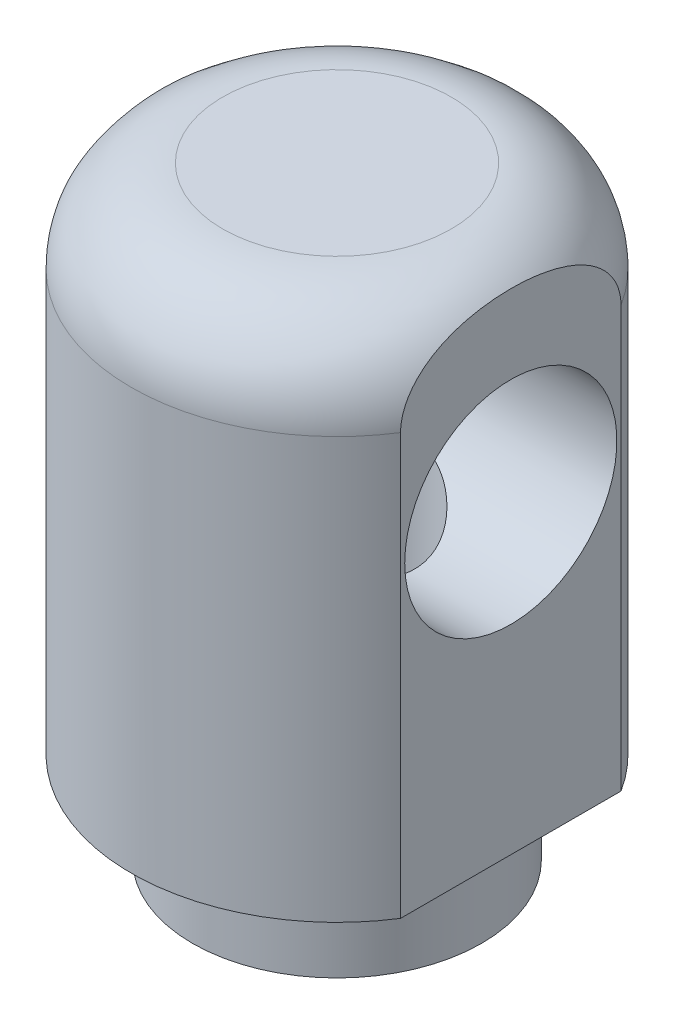
ISO-10303-21;
HEADER;
FILE_DESCRIPTION(('STEP AP214'),'2;1');
FILE_NAME('part.step','',(''),(''),'','','');
FILE_SCHEMA(('AUTOMOTIVE_DESIGN { 1 0 10303 214 1 1 1 1 }'));
ENDSEC;
DATA;
#1=APPLICATION_CONTEXT('core data for automotive mechanical design processes');
#2=APPLICATION_PROTOCOL_DEFINITION('international standard','automotive_design',2000,#1);
#3=PRODUCT_CONTEXT('',#1,'mechanical');
#4=PRODUCT('Part','Part','',(#3));
#5=PRODUCT_RELATED_PRODUCT_CATEGORY('part','',(#4));
#6=PRODUCT_DEFINITION_FORMATION('','',#4);
#7=PRODUCT_DEFINITION_CONTEXT('part definition',#1,'design');
#8=PRODUCT_DEFINITION('design','',#6,#7);
#9=PRODUCT_DEFINITION_SHAPE('','',#8);
#10=(LENGTH_UNIT() NAMED_UNIT(*) SI_UNIT(.MILLI.,.METRE.));
#11=(NAMED_UNIT(*) PLANE_ANGLE_UNIT() SI_UNIT($,.RADIAN.));
#12=(NAMED_UNIT(*) SI_UNIT($,.STERADIAN.) SOLID_ANGLE_UNIT());
#13=UNCERTAINTY_MEASURE_WITH_UNIT(LENGTH_MEASURE(1.E-05),#10,'distance_accuracy_value','');
#14=(GEOMETRIC_REPRESENTATION_CONTEXT(3) GLOBAL_UNCERTAINTY_ASSIGNED_CONTEXT((#13)) GLOBAL_UNIT_ASSIGNED_CONTEXT((#10,
#11,#12)) REPRESENTATION_CONTEXT('',''));
#15=CARTESIAN_POINT('',(0.,0.,0.));
#16=DIRECTION('',(0.,0.,1.));
#17=DIRECTION('',(1.,0.,0.));
#18=AXIS2_PLACEMENT_3D('',#15,#16,#17);
#19=CARTESIAN_POINT('',(0.,33.,0.));
#20=DIRECTION('',(0.,-1.,0.));
#21=DIRECTION('',(0.,0.,-1.));
#22=AXIS2_PLACEMENT_3D('',#19,#20,#21);
#23=CYLINDRICAL_SURFACE('',#22,11.25);
#24=CARTESIAN_POINT('',(0.,5.,0.));
#25=DIRECTION('',(0.,-1.,0.));
#26=DIRECTION('',(0.,0.,-1.));
#27=AXIS2_PLACEMENT_3D('',#24,#25,#26);
#28=CIRCLE('',#27,11.25);
#29=CARTESIAN_POINT('',(-9.5,5.,-6.02598539659699));
#30=VERTEX_POINT('',#29);
#31=CARTESIAN_POINT('',(9.5,5.,-6.02598539659699));
#32=VERTEX_POINT('',#31);
#33=EDGE_CURVE('E57',#30,#32,#28,.T.);
#34=ORIENTED_EDGE('',*,*,#33,.F.);
#35=DIRECTION('',(0.,1.,0.));
#36=VECTOR('',#35,1.);
#37=CARTESIAN_POINT('',(-9.5,0.,-6.02598539659699));
#38=LINE('',#37,#36);
#39=CARTESIAN_POINT('',(-9.5,28.0000000000007,-6.02598539659699));
#40=VERTEX_POINT('',#39);
#41=EDGE_CURVE('E97',#30,#40,#38,.T.);
#42=ORIENTED_EDGE('',*,*,#41,.T.);
#43=CARTESIAN_POINT('',(0.,28.,0.));
#44=DIRECTION('',(0.,1.,0.));
#45=DIRECTION('',(0.,0.,1.));
#46=AXIS2_PLACEMENT_3D('',#43,#44,#45);
#47=CIRCLE('',#46,11.25);
#48=CARTESIAN_POINT('',(9.5,28.,-6.02598539659698));
#49=VERTEX_POINT('',#48);
#50=EDGE_CURVE('E109',#40,#49,#47,.F.);
#51=ORIENTED_EDGE('',*,*,#50,.T.);
#52=DIRECTION('',(0.,1.,0.));
#53=VECTOR('',#52,1.);
#54=CARTESIAN_POINT('',(9.5,0.,-6.02598539659699));
#55=LINE('',#54,#53);
#56=EDGE_CURVE('E64',#32,#49,#55,.T.);
#57=ORIENTED_EDGE('',*,*,#56,.F.);
#58=EDGE_LOOP('',(#34,#42,#51,#57));
#59=FACE_BOUND('',#58,.T.);
#60=ADVANCED_FACE('F42',(#59),#23,.T.);
#61=CARTESIAN_POINT('',(0.,5.,0.));
#62=DIRECTION('',(0.,-1.,0.));
#63=DIRECTION('',(0.,0.,-1.));
#64=AXIS2_PLACEMENT_3D('',#61,#62,#63);
#65=CIRCLE('',#64,11.25);
#66=CARTESIAN_POINT('',(9.5,5.,6.02598539659699));
#67=VERTEX_POINT('',#66);
#68=CARTESIAN_POINT('',(-9.5,5.,6.02598539659699));
#69=VERTEX_POINT('',#68);
#70=EDGE_CURVE('E83',#67,#69,#65,.T.);
#71=ORIENTED_EDGE('',*,*,#70,.F.);
#72=DIRECTION('',(0.,1.,0.));
#73=VECTOR('',#72,1.);
#74=CARTESIAN_POINT('',(9.5,0.,6.02598539659699));
#75=LINE('',#74,#73);
#76=CARTESIAN_POINT('',(9.5,28.0000000000007,6.02598539659699));
#77=VERTEX_POINT('',#76);
#78=EDGE_CURVE('E90',#67,#77,#75,.T.);
#79=ORIENTED_EDGE('',*,*,#78,.T.);
#80=CARTESIAN_POINT('',(-9.5,28.,6.02598539659698));
#81=VERTEX_POINT('',#80);
#82=EDGE_CURVE('E108',#77,#81,#47,.F.);
#83=ORIENTED_EDGE('',*,*,#82,.T.);
#84=DIRECTION('',(0.,1.,0.));
#85=VECTOR('',#84,1.);
#86=CARTESIAN_POINT('',(-9.5,0.,6.02598539659699));
#87=LINE('',#86,#85);
#88=EDGE_CURVE('E91',#69,#81,#87,.T.);
#89=ORIENTED_EDGE('',*,*,#88,.F.);
#90=EDGE_LOOP('',(#71,#79,#83,#89));
#91=FACE_BOUND('',#90,.T.);
#92=ADVANCED_FACE('F88',(#91),#23,.T.);
#93=CARTESIAN_POINT('',(-9.5,0.,-6.02598539659699));
#94=DIRECTION('',(1.,0.,0.));
#95=DIRECTION('',(0.,0.,-1.));
#96=AXIS2_PLACEMENT_3D('',#93,#94,#95);
#97=PLANE('',#96);
#98=CARTESIAN_POINT('',(-9.5,21.7,0.));
#99=DIRECTION('',(-1.,0.,0.));
#100=DIRECTION('',(0.,0.,1.));
#101=AXIS2_PLACEMENT_3D('',#98,#99,#100);
#102=CIRCLE('',#101,5.8);
#103=CARTESIAN_POINT('',(-9.5,21.7,5.8));
#104=VERTEX_POINT('',#103);
#105=EDGE_CURVE('E181',#104,#104,#102,.T.);
#106=ORIENTED_EDGE('',*,*,#105,.F.);
#107=EDGE_LOOP('',(#106));
#108=FACE_BOUND('',#107,.T.);
#109=DIRECTION('',(0.,0.,-1.));
#110=VECTOR('',#109,1.);
#111=CARTESIAN_POINT('',(-9.5,5.,-6.02598539659699));
#112=LINE('',#111,#110);
#113=EDGE_CURVE('E99',#69,#30,#112,.T.);
#114=ORIENTED_EDGE('',*,*,#113,.F.);
#115=ORIENTED_EDGE('',*,*,#88,.T.);
#116=CARTESIAN_POINT('',(-9.5,31.7996710383927,0.));
#117=CARTESIAN_POINT('',(-9.5,31.7996708050423,-0.279670870741043));
#118=CARTESIAN_POINT('',(-9.5,31.7891715402592,-0.559344744223437));
#119=CARTESIAN_POINT('',(-9.5,31.7463936985155,-1.1172698087531));
#120=CARTESIAN_POINT('',(-9.5,31.7140993026617,-1.39551981846079));
#121=CARTESIAN_POINT('',(-9.5,31.6255672065042,-1.94748383468834));
#122=CARTESIAN_POINT('',(-9.5,31.5693961558459,-2.22120828074409));
#123=CARTESIAN_POINT('',(-9.5,31.4295636622985,-2.76133707213147));
#124=CARTESIAN_POINT('',(-9.5,31.345941225761,-3.0277512261592));
#125=CARTESIAN_POINT('',(-9.5,31.1585622517197,-3.51672989052504));
#126=CARTESIAN_POINT('',(-9.5,31.0584960604432,-3.74068429183623));
#127=CARTESIAN_POINT('',(-9.5,30.829878578779,-4.17385372431448));
#128=CARTESIAN_POINT('',(-9.5,30.701322419577,-4.38306622809012));
#129=CARTESIAN_POINT('',(-9.5,30.4103344670636,-4.78162250936401));
#130=CARTESIAN_POINT('',(-9.5,30.2474705718199,-4.97066143106628));
#131=CARTESIAN_POINT('',(-9.5,29.9782421323109,-5.22760048626258));
#132=CARTESIAN_POINT('',(-9.5,29.8844112888537,-5.30876722148792));
#133=CARTESIAN_POINT('',(-9.5,29.6886648610369,-5.46062537597885));
#134=CARTESIAN_POINT('',(-9.5,29.586754331402,-5.53132326647773));
#135=CARTESIAN_POINT('',(-9.5,29.3427165140696,-5.680425233222));
#136=CARTESIAN_POINT('',(-9.5,29.1978790960453,-5.75448185997365));
#137=CARTESIAN_POINT('',(-9.5,28.8979582866462,-5.87759195427805));
#138=CARTESIAN_POINT('',(-9.5,28.7428818590703,-5.92666222175381));
#139=CARTESIAN_POINT('',(-9.5,28.4257193915887,-5.99690551834174));
#140=CARTESIAN_POINT('',(-9.5,28.2636051136875,-6.01795284821393));
#141=CARTESIAN_POINT('',(-9.5,27.9382488652614,-6.03021375518322));
#142=CARTESIAN_POINT('',(-9.5,27.7750070427304,-6.02143117599024));
#143=CARTESIAN_POINT('',(-9.5,27.4639919366251,-5.9763267596998));
#144=CARTESIAN_POINT('',(-9.5,27.3159295588177,-5.94195116970475));
#145=CARTESIAN_POINT('',(-9.5,27.0272628029556,-5.84998879252079));
#146=CARTESIAN_POINT('',(-9.5,26.8866590690599,-5.79240000422613));
#147=CARTESIAN_POINT('',(-9.5,26.6088089943949,-5.65354346691621));
#148=CARTESIAN_POINT('',(-9.5,26.4720913017505,-5.57122626217637));
#149=CARTESIAN_POINT('',(-9.5,26.2117441063437,-5.38809056030936));
#150=CARTESIAN_POINT('',(-9.5,26.0881222525818,-5.28726134364731));
#151=CARTESIAN_POINT('',(-9.5,25.7935117040536,-5.0140258158028));
#152=CARTESIAN_POINT('',(-9.5,25.6316267267294,-4.83179024127889));
#153=CARTESIAN_POINT('',(-9.5,25.3390338254589,-4.44382074973273));
#154=CARTESIAN_POINT('',(-9.5,25.2083930100324,-4.23803763159874));
#155=CARTESIAN_POINT('',(-9.5,25.0035526491677,-3.86258597393054));
#156=CARTESIAN_POINT('',(-9.5,24.9233338906109,-3.69612076185946));
#157=CARTESIAN_POINT('',(-9.5,24.7777129840948,-3.35676526323346));
#158=CARTESIAN_POINT('',(-9.5,24.7123189125189,-3.18387153388199));
#159=CARTESIAN_POINT('',(-9.5,24.5947792065012,-2.833215912678));
#160=CARTESIAN_POINT('',(-9.5,24.5426667129703,-2.65544304585664));
#161=CARTESIAN_POINT('',(-9.5,24.4505514720195,-2.29676591593157));
#162=CARTESIAN_POINT('',(-9.5,24.4105528664839,-2.11586060410691));
#163=CARTESIAN_POINT('',(-9.5,24.321096402495,-1.64417576084996));
#164=CARTESIAN_POINT('',(-9.5,24.280068730645,-1.35178450867042));
#165=CARTESIAN_POINT('',(-9.5,24.2226804495083,-0.764482582306692));
#166=CARTESIAN_POINT('',(-9.5,24.2063386418238,-0.469570159651569));
#167=CARTESIAN_POINT('',(-9.5,24.1970622086418,0.120545703120495));
#168=CARTESIAN_POINT('',(-9.5,24.204122223301,0.415749061120643));
#169=CARTESIAN_POINT('',(-9.5,24.2421961410873,1.00448169654362));
#170=CARTESIAN_POINT('',(-9.5,24.2731928795348,1.29801202179647));
#171=CARTESIAN_POINT('',(-9.5,24.3442721340549,1.76690513967831));
#172=CARTESIAN_POINT('',(-9.5,24.3760481332384,1.94354550549098));
#173=CARTESIAN_POINT('',(-9.5,24.4502613333082,2.29455604389029));
#174=CARTESIAN_POINT('',(-9.5,24.4926957373979,2.4689267994238));
#175=CARTESIAN_POINT('',(-9.5,24.589215906691,2.81408638405518));
#176=CARTESIAN_POINT('',(-9.5,24.6432788057036,2.9848815311023));
#177=CARTESIAN_POINT('',(-9.5,24.7643368052573,3.32177829524241));
#178=CARTESIAN_POINT('',(-9.5,24.8313275194528,3.48788148244319));
#179=CARTESIAN_POINT('',(-9.5,25.0111014773812,3.88278193202645));
#180=CARTESIAN_POINT('',(-9.5,25.1312600614605,4.10831879786527));
#181=CARTESIAN_POINT('',(-9.5,25.4045376381657,4.53866231966843));
#182=CARTESIAN_POINT('',(-9.5,25.5576154731671,4.74349439614384));
#183=CARTESIAN_POINT('',(-9.5,25.8564487409402,5.07424350829645));
#184=CARTESIAN_POINT('',(-9.5,25.9944866000124,5.20709380333211));
#185=CARTESIAN_POINT('',(-9.5,26.29016018565,5.44893060030119));
#186=CARTESIAN_POINT('',(-9.5,26.4477713282214,5.55794657214276));
#187=CARTESIAN_POINT('',(-9.5,26.7542695307914,5.73090311149418));
#188=CARTESIAN_POINT('',(-9.5,26.9006739686262,5.79922459885083));
#189=CARTESIAN_POINT('',(-9.5,27.2028947801127,5.91046457310525));
#190=CARTESIAN_POINT('',(-9.5,27.3587069508271,5.95339431265505));
#191=CARTESIAN_POINT('',(-9.5,27.6761244016137,6.01119040510846));
#192=CARTESIAN_POINT('',(-9.5,27.8377494081091,6.02594972794181));
#193=CARTESIAN_POINT('',(-9.5,28.1610007112346,6.02602091961021));
#194=CARTESIAN_POINT('',(-9.5,28.3226270062113,6.01133565152179));
#195=CARTESIAN_POINT('',(-9.5,28.6304759960112,5.95544020306692));
#196=CARTESIAN_POINT('',(-9.5,28.7770235205904,5.91598224969186));
#197=CARTESIAN_POINT('',(-9.5,29.0620165498404,5.81449019105831));
#198=CARTESIAN_POINT('',(-9.5,29.2004608911399,5.7524528532694));
#199=CARTESIAN_POINT('',(-9.5,29.4754367880731,5.60417559865719));
#200=CARTESIAN_POINT('',(-9.5,29.6112538836369,5.51662041779495));
#201=CARTESIAN_POINT('',(-9.5,29.8692061072609,5.32338708327006));
#202=CARTESIAN_POINT('',(-9.5,29.991334864987,5.2177005489884));
#203=CARTESIAN_POINT('',(-9.5,30.2849089659793,4.92958917893516));
#204=CARTESIAN_POINT('',(-9.5,30.4463896577078,4.73699590489314));
#205=CARTESIAN_POINT('',(-9.5,30.7367561261823,4.32846114880914));
#206=CARTESIAN_POINT('',(-9.5,30.8655477269863,4.11245470942179));
#207=CARTESIAN_POINT('',(-9.5,31.0673273333156,3.71721305536385));
#208=CARTESIAN_POINT('',(-9.5,31.1463355949186,3.54097401097781));
#209=CARTESIAN_POINT('',(-9.5,31.2886991267567,3.18220428201347));
#210=CARTESIAN_POINT('',(-9.5,31.3520447661595,2.99966980462454));
#211=CARTESIAN_POINT('',(-9.5,31.4646743375778,2.63032458679271));
#212=CARTESIAN_POINT('',(-9.5,31.5139551340106,2.44351290281128));
#213=CARTESIAN_POINT('',(-9.5,31.5998499338813,2.06709065365015));
#214=CARTESIAN_POINT('',(-9.5,31.6364670613185,1.87748079080435));
#215=CARTESIAN_POINT('',(-9.5,31.7124791466162,1.40842414021914));
#216=CARTESIAN_POINT('',(-9.5,31.7453526856337,1.12791375019056));
#217=CARTESIAN_POINT('',(-9.5,31.7889612305774,0.564937824767308));
#218=CARTESIAN_POINT('',(-9.5,31.799671274079,0.282470443962943));
#219=CARTESIAN_POINT('',(-9.5,31.7996710383927,0.));
#220=B_SPLINE_CURVE_WITH_KNOTS('',3,(#116,#117,#118,#119,#120,#121,#122,#123,#124,#125,#126,
#127,#128,#129,#130,#131,#132,#133,#134,#135,#136,#137,#138,#139,#140,#141,#142,#143,#144,#145,
#146,#147,#148,#149,#150,#151,#152,#153,#154,#155,#156,#157,#158,#159,#160,#161,#162,#163,#164,
#165,#166,#167,#168,#169,#170,#171,#172,#173,#174,#175,#176,#177,#178,#179,#180,#181,#182,#183,
#184,#185,#186,#187,#188,#189,#190,#191,#192,#193,#194,#195,#196,#197,#198,#199,#200,#201,#202,
#203,#204,#205,#206,#207,#208,#209,#210,#211,#212,#213,#214,#215,#216,#217,#218,#219),
.UNSPECIFIED.,.T.,.F.,(4,2,2,2,2,2,2,2,2,2,2,2,2,2,2,2,2,2,2,2,2,2,2,2,2,2,2,2,2,2,2,2,2,2,2,2,
2,2,2,2,2,2,2,2,2,2,2,2,2,2,2,4),(0.,0.838812030279994,1.6782335255042,2.51532707756618,
3.35123629424655,4.08538432187943,4.81965790916431,5.56380097760614,5.9354014101071,
6.30677117318226,6.79267055626643,7.27824280537828,7.76598587289074,8.25366609503114,
8.70762472976809,9.16162250661563,9.63856074517985,10.1157760348773,10.8429379894546,
11.5716480445993,12.1252618203771,12.6791764800202,13.2344600561264,13.7899332765909,
14.6744223625123,15.5595847666521,16.4445444513759,17.32887013287,17.867022208867,
18.4050332194414,18.9419958060591,19.478776523163,20.2430238976377,21.0063212623938,
21.579006041749,22.1509786703811,22.6336111812364,23.1160296472462,23.6002773830743,
24.0844780348354,24.5377839214549,24.9911547302083,25.4741128709179,25.9572948474889,
26.7070479181038,27.4589370871769,28.0375701484808,28.61655812713,29.1956750833358,
29.774649075161,30.6209052087804,31.4681139508522),.UNSPECIFIED.);
#221=EDGE_CURVE('E112',#81,#40,#220,.T.);
#222=ORIENTED_EDGE('',*,*,#221,.T.);
#223=ORIENTED_EDGE('',*,*,#41,.F.);
#224=EDGE_LOOP('',(#114,#115,#222,#223));
#225=FACE_BOUND('',#224,.T.);
#226=ADVANCED_FACE('F122',(#108,#225),#97,.F.);
#227=CARTESIAN_POINT('',(9.5,0.,-6.02598539659699));
#228=DIRECTION('',(-1.,0.,0.));
#229=DIRECTION('',(0.,0.,1.));
#230=AXIS2_PLACEMENT_3D('',#227,#228,#229);
#231=PLANE('',#230);
#232=CARTESIAN_POINT('',(9.5,21.7,0.));
#233=DIRECTION('',(-1.,0.,0.));
#234=DIRECTION('',(0.,0.,1.));
#235=AXIS2_PLACEMENT_3D('',#232,#233,#234);
#236=CIRCLE('',#235,5.8);
#237=CARTESIAN_POINT('',(9.5,21.7,5.8));
#238=VERTEX_POINT('',#237);
#239=EDGE_CURVE('E182',#238,#238,#236,.T.);
#240=ORIENTED_EDGE('',*,*,#239,.T.);
#241=EDGE_LOOP('',(#240));
#242=FACE_BOUND('',#241,.T.);
#243=DIRECTION('',(0.,0.,1.));
#244=VECTOR('',#243,1.);
#245=CARTESIAN_POINT('',(9.5,5.,-6.02598539659699));
#246=LINE('',#245,#244);
#247=EDGE_CURVE('E12',#32,#67,#246,.T.);
#248=ORIENTED_EDGE('',*,*,#247,.F.);
#249=ORIENTED_EDGE('',*,*,#56,.T.);
#250=CARTESIAN_POINT('',(9.5,31.7996710383927,0.));
#251=CARTESIAN_POINT('',(9.5,31.7996708050423,0.279670870741043));
#252=CARTESIAN_POINT('',(9.5,31.7891715402592,0.559344744223437));
#253=CARTESIAN_POINT('',(9.5,31.7463936985155,1.1172698087531));
#254=CARTESIAN_POINT('',(9.5,31.7140993026617,1.39551981846079));
#255=CARTESIAN_POINT('',(9.5,31.6255672065042,1.94748383468834));
#256=CARTESIAN_POINT('',(9.5,31.5693961558459,2.22120828074409));
#257=CARTESIAN_POINT('',(9.5,31.4295636622985,2.76133707213147));
#258=CARTESIAN_POINT('',(9.5,31.345941225761,3.0277512261592));
#259=CARTESIAN_POINT('',(9.5,31.1585622517197,3.51672989052504));
#260=CARTESIAN_POINT('',(9.5,31.0584960604432,3.74068429183623));
#261=CARTESIAN_POINT('',(9.5,30.829878578779,4.17385372431448));
#262=CARTESIAN_POINT('',(9.5,30.701322419577,4.38306622809012));
#263=CARTESIAN_POINT('',(9.5,30.4103344670636,4.78162250936401));
#264=CARTESIAN_POINT('',(9.5,30.2474705718199,4.97066143106628));
#265=CARTESIAN_POINT('',(9.5,29.9782421323109,5.22760048626258));
#266=CARTESIAN_POINT('',(9.5,29.8844112888537,5.30876722148792));
#267=CARTESIAN_POINT('',(9.5,29.6886648610369,5.46062537597885));
#268=CARTESIAN_POINT('',(9.5,29.586754331402,5.53132326647773));
#269=CARTESIAN_POINT('',(9.5,29.3427165140696,5.680425233222));
#270=CARTESIAN_POINT('',(9.5,29.1978790960453,5.75448185997365));
#271=CARTESIAN_POINT('',(9.5,28.8979582866462,5.87759195427805));
#272=CARTESIAN_POINT('',(9.5,28.7428818590703,5.92666222175381));
#273=CARTESIAN_POINT('',(9.5,28.4257193915887,5.99690551834174));
#274=CARTESIAN_POINT('',(9.5,28.2636051136875,6.01795284821393));
#275=CARTESIAN_POINT('',(9.5,27.9382488652614,6.03021375518322));
#276=CARTESIAN_POINT('',(9.5,27.7750070427304,6.02143117599024));
#277=CARTESIAN_POINT('',(9.5,27.4639919366251,5.9763267596998));
#278=CARTESIAN_POINT('',(9.5,27.3159295588177,5.94195116970475));
#279=CARTESIAN_POINT('',(9.5,27.0272628029556,5.84998879252079));
#280=CARTESIAN_POINT('',(9.5,26.8866590690599,5.79240000422613));
#281=CARTESIAN_POINT('',(9.5,26.6088089943949,5.65354346691621));
#282=CARTESIAN_POINT('',(9.5,26.4720913017505,5.57122626217637));
#283=CARTESIAN_POINT('',(9.5,26.2117441063437,5.38809056030936));
#284=CARTESIAN_POINT('',(9.5,26.0881222525818,5.28726134364731));
#285=CARTESIAN_POINT('',(9.5,25.7935117040536,5.0140258158028));
#286=CARTESIAN_POINT('',(9.5,25.6316267267294,4.83179024127889));
#287=CARTESIAN_POINT('',(9.5,25.3390338254589,4.44382074973273));
#288=CARTESIAN_POINT('',(9.5,25.2083930100324,4.23803763159874));
#289=CARTESIAN_POINT('',(9.5,25.0035526491677,3.86258597393054));
#290=CARTESIAN_POINT('',(9.5,24.9233338906109,3.69612076185946));
#291=CARTESIAN_POINT('',(9.5,24.7777129840948,3.35676526323346));
#292=CARTESIAN_POINT('',(9.5,24.7123189125189,3.18387153388199));
#293=CARTESIAN_POINT('',(9.5,24.5947792065012,2.833215912678));
#294=CARTESIAN_POINT('',(9.5,24.5426667129703,2.65544304585664));
#295=CARTESIAN_POINT('',(9.5,24.4505514720195,2.29676591593157));
#296=CARTESIAN_POINT('',(9.5,24.4105528664839,2.11586060410691));
#297=CARTESIAN_POINT('',(9.5,24.321096402495,1.64417576084996));
#298=CARTESIAN_POINT('',(9.5,24.280068730645,1.35178450867042));
#299=CARTESIAN_POINT('',(9.5,24.2226804495083,0.764482582306692));
#300=CARTESIAN_POINT('',(9.5,24.2063386418238,0.469570159651569));
#301=CARTESIAN_POINT('',(9.5,24.1970622086418,-0.120545703120495));
#302=CARTESIAN_POINT('',(9.5,24.204122223301,-0.415749061120643));
#303=CARTESIAN_POINT('',(9.5,24.2421961410873,-1.00448169654362));
#304=CARTESIAN_POINT('',(9.5,24.2731928795348,-1.29801202179647));
#305=CARTESIAN_POINT('',(9.5,24.3442721340549,-1.76690513967831));
#306=CARTESIAN_POINT('',(9.5,24.3760481332384,-1.94354550549098));
#307=CARTESIAN_POINT('',(9.5,24.4502613333082,-2.29455604389029));
#308=CARTESIAN_POINT('',(9.5,24.4926957373979,-2.4689267994238));
#309=CARTESIAN_POINT('',(9.5,24.589215906691,-2.81408638405518));
#310=CARTESIAN_POINT('',(9.5,24.6432788057036,-2.9848815311023));
#311=CARTESIAN_POINT('',(9.5,24.7643368052573,-3.32177829524241));
#312=CARTESIAN_POINT('',(9.5,24.8313275194528,-3.48788148244319));
#313=CARTESIAN_POINT('',(9.5,25.0111014773812,-3.88278193202645));
#314=CARTESIAN_POINT('',(9.5,25.1312600614605,-4.10831879786527));
#315=CARTESIAN_POINT('',(9.5,25.4045376381657,-4.53866231966843));
#316=CARTESIAN_POINT('',(9.5,25.5576154731671,-4.74349439614384));
#317=CARTESIAN_POINT('',(9.5,25.8564487409402,-5.07424350829645));
#318=CARTESIAN_POINT('',(9.5,25.9944866000124,-5.20709380333211));
#319=CARTESIAN_POINT('',(9.5,26.29016018565,-5.44893060030119));
#320=CARTESIAN_POINT('',(9.5,26.4477713282214,-5.55794657214276));
#321=CARTESIAN_POINT('',(9.5,26.7542695307914,-5.73090311149418));
#322=CARTESIAN_POINT('',(9.5,26.9006739686262,-5.79922459885083));
#323=CARTESIAN_POINT('',(9.5,27.2028947801127,-5.91046457310525));
#324=CARTESIAN_POINT('',(9.5,27.3587069508271,-5.95339431265505));
#325=CARTESIAN_POINT('',(9.5,27.6761244016137,-6.01119040510846));
#326=CARTESIAN_POINT('',(9.5,27.8377494081091,-6.02594972794181));
#327=CARTESIAN_POINT('',(9.5,28.1610007112346,-6.02602091961021));
#328=CARTESIAN_POINT('',(9.5,28.3226270062113,-6.01133565152179));
#329=CARTESIAN_POINT('',(9.5,28.6304759960112,-5.95544020306692));
#330=CARTESIAN_POINT('',(9.5,28.7770235205904,-5.91598224969186));
#331=CARTESIAN_POINT('',(9.5,29.0620165498404,-5.81449019105831));
#332=CARTESIAN_POINT('',(9.5,29.2004608911399,-5.7524528532694));
#333=CARTESIAN_POINT('',(9.5,29.4754367880731,-5.60417559865719));
#334=CARTESIAN_POINT('',(9.5,29.6112538836369,-5.51662041779495));
#335=CARTESIAN_POINT('',(9.5,29.8692061072609,-5.32338708327006));
#336=CARTESIAN_POINT('',(9.5,29.991334864987,-5.2177005489884));
#337=CARTESIAN_POINT('',(9.5,30.2849089659793,-4.92958917893516));
#338=CARTESIAN_POINT('',(9.5,30.4463896577078,-4.73699590489314));
#339=CARTESIAN_POINT('',(9.5,30.7367561261823,-4.32846114880914));
#340=CARTESIAN_POINT('',(9.5,30.8655477269863,-4.11245470942179));
#341=CARTESIAN_POINT('',(9.5,31.0673273333156,-3.71721305536385));
#342=CARTESIAN_POINT('',(9.5,31.1463355949186,-3.54097401097781));
#343=CARTESIAN_POINT('',(9.5,31.2886991267567,-3.18220428201347));
#344=CARTESIAN_POINT('',(9.5,31.3520447661595,-2.99966980462454));
#345=CARTESIAN_POINT('',(9.5,31.4646743375778,-2.63032458679271));
#346=CARTESIAN_POINT('',(9.5,31.5139551340106,-2.44351290281128));
#347=CARTESIAN_POINT('',(9.5,31.5998499338813,-2.06709065365015));
#348=CARTESIAN_POINT('',(9.5,31.6364670613185,-1.87748079080435));
#349=CARTESIAN_POINT('',(9.5,31.7124791466162,-1.40842414021914));
#350=CARTESIAN_POINT('',(9.5,31.7453526856337,-1.12791375019056));
#351=CARTESIAN_POINT('',(9.5,31.7889612305774,-0.564937824767308));
#352=CARTESIAN_POINT('',(9.5,31.799671274079,-0.282470443962943));
#353=CARTESIAN_POINT('',(9.5,31.7996710383927,0.));
#354=B_SPLINE_CURVE_WITH_KNOTS('',3,(#250,#251,#252,#253,#254,#255,#256,#257,#258,#259,#260,
#261,#262,#263,#264,#265,#266,#267,#268,#269,#270,#271,#272,#273,#274,#275,#276,#277,#278,#279,
#280,#281,#282,#283,#284,#285,#286,#287,#288,#289,#290,#291,#292,#293,#294,#295,#296,#297,#298,
#299,#300,#301,#302,#303,#304,#305,#306,#307,#308,#309,#310,#311,#312,#313,#314,#315,#316,#317,
#318,#319,#320,#321,#322,#323,#324,#325,#326,#327,#328,#329,#330,#331,#332,#333,#334,#335,#336,
#337,#338,#339,#340,#341,#342,#343,#344,#345,#346,#347,#348,#349,#350,#351,#352,#353),
.UNSPECIFIED.,.T.,.F.,(4,2,2,2,2,2,2,2,2,2,2,2,2,2,2,2,2,2,2,2,2,2,2,2,2,2,2,2,2,2,2,2,2,2,2,2,
2,2,2,2,2,2,2,2,2,2,2,2,2,2,2,4),(0.,0.838812030279994,1.6782335255042,2.51532707756618,
3.35123629424655,4.08538432187943,4.81965790916431,5.56380097760614,5.9354014101071,
6.30677117318226,6.79267055626643,7.27824280537828,7.76598587289074,8.25366609503114,
8.70762472976809,9.16162250661563,9.63856074517985,10.1157760348773,10.8429379894546,
11.5716480445993,12.1252618203771,12.6791764800202,13.2344600561264,13.7899332765909,
14.6744223625123,15.5595847666521,16.4445444513759,17.32887013287,17.867022208867,
18.4050332194414,18.9419958060591,19.478776523163,20.2430238976377,21.0063212623938,
21.579006041749,22.1509786703811,22.6336111812364,23.1160296472462,23.6002773830743,
24.0844780348354,24.5377839214549,24.9911547302083,25.4741128709179,25.9572948474889,
26.7070479181038,27.4589370871769,28.0375701484808,28.61655812713,29.1956750833358,
29.774649075161,30.6209052087804,31.4681139508522),.UNSPECIFIED.);
#355=EDGE_CURVE('E51',#49,#77,#354,.T.);
#356=ORIENTED_EDGE('',*,*,#355,.T.);
#357=ORIENTED_EDGE('',*,*,#78,.F.);
#358=EDGE_LOOP('',(#248,#249,#356,#357));
#359=FACE_BOUND('',#358,.T.);
#360=ADVANCED_FACE('F94',(#242,#359),#231,.F.);
#361=CARTESIAN_POINT('',(0.,33.,0.));
#362=DIRECTION('',(0.,1.,0.));
#363=DIRECTION('',(0.,0.,1.));
#364=AXIS2_PLACEMENT_3D('',#361,#362,#363);
#365=PLANE('',#364);
#366=CARTESIAN_POINT('',(0.,33.,0.));
#367=DIRECTION('',(0.,1.,0.));
#368=DIRECTION('',(0.,0.,1.));
#369=AXIS2_PLACEMENT_3D('',#366,#367,#368);
#370=CIRCLE('',#369,6.25);
#371=CARTESIAN_POINT('',(0.,33.,6.25));
#372=VERTEX_POINT('',#371);
#373=EDGE_CURVE('E104',#372,#372,#370,.T.);
#374=ORIENTED_EDGE('',*,*,#373,.T.);
#375=EDGE_LOOP('',(#374));
#376=FACE_BOUND('',#375,.T.);
#377=ADVANCED_FACE('F129',(#376),#365,.T.);
#378=CARTESIAN_POINT('',(0.,28.,0.));
#379=DIRECTION('',(0.,1.,0.));
#380=DIRECTION('',(0.,0.,1.));
#381=AXIS2_PLACEMENT_3D('',#378,#379,#380);
#382=TOROIDAL_SURFACE('',#381,6.25,5.);
#383=ORIENTED_EDGE('',*,*,#355,.F.);
#384=ORIENTED_EDGE('',*,*,#50,.F.);
#385=ORIENTED_EDGE('',*,*,#221,.F.);
#386=ORIENTED_EDGE('',*,*,#82,.F.);
#387=EDGE_LOOP('',(#383,#384,#385,#386));
#388=FACE_BOUND('',#387,.T.);
#389=ORIENTED_EDGE('',*,*,#373,.F.);
#390=EDGE_LOOP('',(#389));
#391=FACE_BOUND('',#390,.T.);
#392=ADVANCED_FACE('F44',(#388,#391),#382,.T.);
#393=CARTESIAN_POINT('',(0.,5.,0.));
#394=DIRECTION('',(0.,-1.,0.));
#395=DIRECTION('',(0.,0.,-1.));
#396=AXIS2_PLACEMENT_3D('',#393,#394,#395);
#397=PLANE('',#396);
#398=CARTESIAN_POINT('',(0.,5.,0.));
#399=DIRECTION('',(0.,-1.,0.));
#400=DIRECTION('',(0.,0.,-1.));
#401=AXIS2_PLACEMENT_3D('',#398,#399,#400);
#402=CIRCLE('',#401,7.9);
#403=CARTESIAN_POINT('',(0.,5.,-7.9));
#404=VERTEX_POINT('',#403);
#405=EDGE_CURVE('E92',#404,#404,#402,.T.);
#406=ORIENTED_EDGE('',*,*,#405,.F.);
#407=EDGE_LOOP('',(#406));
#408=FACE_BOUND('',#407,.T.);
#409=ORIENTED_EDGE('',*,*,#113,.T.);
#410=ORIENTED_EDGE('',*,*,#33,.T.);
#411=ORIENTED_EDGE('',*,*,#247,.T.);
#412=ORIENTED_EDGE('',*,*,#70,.T.);
#413=EDGE_LOOP('',(#409,#410,#411,#412));
#414=FACE_BOUND('',#413,.T.);
#415=ADVANCED_FACE('F82',(#408,#414),#397,.T.);
#416=CARTESIAN_POINT('',(0.,5.,0.));
#417=DIRECTION('',(0.,-1.,0.));
#418=DIRECTION('',(0.,0.,-1.));
#419=AXIS2_PLACEMENT_3D('',#416,#417,#418);
#420=CYLINDRICAL_SURFACE('',#419,7.9);
#421=ORIENTED_EDGE('',*,*,#405,.T.);
#422=EDGE_LOOP('',(#421));
#423=FACE_BOUND('',#422,.T.);
#424=CARTESIAN_POINT('',(0.,0.,0.));
#425=DIRECTION('',(0.,-1.,0.));
#426=DIRECTION('',(0.,0.,-1.));
#427=AXIS2_PLACEMENT_3D('',#424,#425,#426);
#428=CIRCLE('',#427,7.9);
#429=CARTESIAN_POINT('',(0.,0.,-7.9));
#430=VERTEX_POINT('',#429);
#431=EDGE_CURVE('E185',#430,#430,#428,.T.);
#432=ORIENTED_EDGE('',*,*,#431,.F.);
#433=EDGE_LOOP('',(#432));
#434=FACE_BOUND('',#433,.T.);
#435=ADVANCED_FACE('F136',(#423,#434),#420,.T.);
#436=CARTESIAN_POINT('',(0.,0.,0.));
#437=DIRECTION('',(0.,1.,0.));
#438=DIRECTION('',(0.,0.,1.));
#439=AXIS2_PLACEMENT_3D('',#436,#437,#438);
#440=PLANE('',#439);
#441=CARTESIAN_POINT('',(0.,0.,0.));
#442=DIRECTION('',(0.,-1.,0.));
#443=DIRECTION('',(0.,0.,-1.));
#444=AXIS2_PLACEMENT_3D('',#441,#442,#443);
#445=CIRCLE('',#444,4.25);
#446=CARTESIAN_POINT('',(0.,0.,-4.25));
#447=VERTEX_POINT('',#446);
#448=EDGE_CURVE('E178',#447,#447,#445,.T.);
#449=ORIENTED_EDGE('',*,*,#448,.F.);
#450=EDGE_LOOP('',(#449));
#451=FACE_BOUND('',#450,.T.);
#452=ORIENTED_EDGE('',*,*,#431,.T.);
#453=EDGE_LOOP('',(#452));
#454=FACE_BOUND('',#453,.T.);
#455=ADVANCED_FACE('F133',(#451,#454),#440,.F.);
#456=CARTESIAN_POINT('',(9.5,21.7,0.));
#457=DIRECTION('',(-1.,0.,0.));
#458=DIRECTION('',(0.,0.,1.));
#459=AXIS2_PLACEMENT_3D('',#456,#457,#458);
#460=CYLINDRICAL_SURFACE('',#459,5.8);
#461=CARTESIAN_POINT('',(0.,17.7531658256268,-4.25));
#462=CARTESIAN_POINT('',(-0.100174940461338,17.7531667075147,-4.25000042723048));
#463=CARTESIAN_POINT('',(-0.200345215700077,17.7493328382864,-4.2464499315378));
#464=CARTESIAN_POINT('',(-0.399666210024687,17.7342277003189,-4.23234634466937));
#465=CARTESIAN_POINT('',(-0.498816394433082,17.7229527147889,-4.22178975397841));
#466=CARTESIAN_POINT('',(-0.695343641430595,17.6935632013407,-4.19390878297105));
#467=CARTESIAN_POINT('',(-0.792716294312059,17.675433592076,-4.17656947658541));
#468=CARTESIAN_POINT('',(-0.984811566803959,17.6332373891003,-4.13549372806403));
#469=CARTESIAN_POINT('',(-1.07953256923061,17.6091672565958,-4.11175347207438));
#470=CARTESIAN_POINT('',(-1.35641293405686,17.5303060640649,-4.03226403730405));
#471=CARTESIAN_POINT('',(-1.53411085575955,17.4683887981472,-3.96782584473789));
#472=CARTESIAN_POINT('',(-1.87551386499577,17.333033368874,-3.81834518160038));
#473=CARTESIAN_POINT('',(-2.03921992060117,17.2595960035718,-3.73330413806663));
#474=CARTESIAN_POINT('',(-2.38335911092071,17.0922839932081,-3.52562769396833));
#475=CARTESIAN_POINT('',(-2.56074380616051,16.9972315300767,-3.39888738795633));
#476=CARTESIAN_POINT('',(-2.8945630389573,16.8074376847023,-3.11951941178303));
#477=CARTESIAN_POINT('',(-3.05096814704969,16.7126969176012,-2.96685604352476));
#478=CARTESIAN_POINT('',(-3.2817354678555,16.5674709123802,-2.70365961834707));
#479=CARTESIAN_POINT('',(-3.36370715903265,16.5145755023585,-2.60103773680426));
#480=CARTESIAN_POINT('',(-3.51864245799199,16.4127583496618,-2.38727497883563));
#481=CARTESIAN_POINT('',(-3.59160417282317,16.363837442746,-2.27613232016));
#482=CARTESIAN_POINT('',(-3.72748837952443,16.2714463152666,-2.0460065378742));
#483=CARTESIAN_POINT('',(-3.79042873842268,16.2279664242632,-1.92703791487113));
#484=CARTESIAN_POINT('',(-3.90540010718217,16.1477067655798,-1.68187028136193));
#485=CARTESIAN_POINT('',(-3.95743651445802,16.1109236841928,-1.55567488765751));
#486=CARTESIAN_POINT('',(-4.06889009615445,16.0315578853641,-1.24277638695105));
#487=CARTESIAN_POINT('',(-4.12229986524686,15.9929781917526,-1.05283111326388));
#488=CARTESIAN_POINT('',(-4.20237118753982,15.9348751851734,-0.664682178376242));
#489=CARTESIAN_POINT('',(-4.22905540169767,15.9153357281143,-0.466485662311348));
#490=CARTESIAN_POINT('',(-4.25419661900466,15.8969308944726,-0.0668390564132277));
#491=CARTESIAN_POINT('',(-4.25258691888741,15.8981143724506,0.134617602943853));
#492=CARTESIAN_POINT('',(-4.22106690722245,15.9211771359243,0.534105694741199));
#493=CARTESIAN_POINT('',(-4.19114947726973,15.943061627001,0.732136252881774));
#494=CARTESIAN_POINT('',(-4.10611035895202,16.0046670067167,1.11326679928524));
#495=CARTESIAN_POINT('',(-4.05177714589242,16.0438292618592,1.29663708125569));
#496=CARTESIAN_POINT('',(-3.92072322971317,16.1369567620869,1.65111422737994));
#497=CARTESIAN_POINT('',(-3.84399789376797,16.1909250703366,1.8222185446286));
#498=CARTESIAN_POINT('',(-3.66133915573002,16.316874382485,2.16781096850182));
#499=CARTESIAN_POINT('',(-3.55312025056257,16.3901842604764,2.34059816958697));
#500=CARTESIAN_POINT('',(-3.31562443063228,16.5460853581456,2.66643155063483));
#501=CARTESIAN_POINT('',(-3.1863277181365,16.628685280837,2.81945892626805));
#502=CARTESIAN_POINT('',(-2.88250422266653,16.8143952153638,3.13207396300482));
#503=CARTESIAN_POINT('',(-2.70405629917998,16.9184068723728,3.2873205257745));
#504=CARTESIAN_POINT('',(-2.32266070562417,17.123287521905,3.56702963769469));
#505=CARTESIAN_POINT('',(-2.1197075625848,17.2241558060386,3.69148529104166));
#506=CARTESIAN_POINT('',(-1.73603415643167,17.3909133667178,3.88386215215107));
#507=CARTESIAN_POINT('',(-1.55978719976977,17.4596767382371,3.95817883004255));
#508=CARTESIAN_POINT('',(-1.19376937650561,17.5801753612815,4.08345824799153));
#509=CARTESIAN_POINT('',(-1.00403009563729,17.6319488869553,4.13447358363271));
#510=CARTESIAN_POINT('',(-0.647638778401893,17.7035045769468,4.20358132622901));
#511=CARTESIAN_POINT('',(-0.482611791599766,17.7272517887432,4.22582095382605));
#512=CARTESIAN_POINT('',(-0.149464007241387,17.7538139634323,4.25064530892648));
#513=CARTESIAN_POINT('',(0.0186537040763418,17.7566487793814,4.2532486780459));
#514=CARTESIAN_POINT('',(0.352809070857942,17.74094749393,4.23863070116593));
#515=CARTESIAN_POINT('',(0.518848467124577,17.7224306833095,4.22142725026546));
#516=CARTESIAN_POINT('',(0.844830412599014,17.6669751019778,4.16847025865831));
#517=CARTESIAN_POINT('',(1.00476288773667,17.6300071971689,4.13268737759992));
#518=CARTESIAN_POINT('',(1.37793368308373,17.5247732721655,4.02678032200318));
#519=CARTESIAN_POINT('',(1.58704164274974,17.4499061600142,3.94865550416677));
#520=CARTESIAN_POINT('',(1.88595280485377,17.3266660555209,3.81022463307814));
#521=CARTESIAN_POINT('',(1.98325557313333,17.2836958199185,3.76045689272041));
#522=CARTESIAN_POINT('',(2.17293014489822,17.195324428891,3.6541314492688));
#523=CARTESIAN_POINT('',(2.26530244900917,17.1499235212107,3.5975744374406));
#524=CARTESIAN_POINT('',(2.54051436575209,17.0089168293221,3.41436671737346));
#525=CARTESIAN_POINT('',(2.71529969831757,16.9111763166958,3.27703986521039));
#526=CARTESIAN_POINT('',(3.04205867479258,16.7186048887039,2.97618526804889));
#527=CARTESIAN_POINT('',(3.19404992214979,16.6237717735122,2.81267794564064));
#528=CARTESIAN_POINT('',(3.46895009538952,16.4463899293055,2.4650560467081));
#529=CARTESIAN_POINT('',(3.59254110877427,16.3635760301742,2.28162792497403));
#530=CARTESIAN_POINT('',(3.75687219003172,16.251145434667,1.99019716834802));
#531=CARTESIAN_POINT('',(3.80815967218055,16.2156192925244,1.89028657523009));
#532=CARTESIAN_POINT('',(3.90313858245004,16.149249499473,1.68544820847499));
#533=CARTESIAN_POINT('',(3.94683374138169,16.1184035497027,1.58052293152096));
#534=CARTESIAN_POINT('',(4.0264131769306,16.0618519623197,1.36520868413956));
#535=CARTESIAN_POINT('',(4.06222017245828,16.0361973677921,1.25477762704372));
#536=CARTESIAN_POINT('',(4.12488957004571,15.9910823799227,1.03022435831368));
#537=CARTESIAN_POINT('',(4.15175679381332,15.9716186477607,0.916104172989739));
#538=CARTESIAN_POINT('',(4.19604890596647,15.9394362308915,0.685189056426962));
#539=CARTESIAN_POINT('',(4.21348051206634,15.9267127475833,0.56839608999168));
#540=CARTESIAN_POINT('',(4.23856606758867,15.908379497271,0.33321836065726));
#541=CARTESIAN_POINT('',(4.24622170955644,15.9027684988599,0.214833876890379));
#542=CARTESIAN_POINT('',(4.25119540450082,15.8991240337963,-0.00456443841272734));
#543=CARTESIAN_POINT('',(4.2498857234353,15.9000846713253,-0.105533949514851));
#544=CARTESIAN_POINT('',(4.24009895216956,15.9072521406126,-0.306970848417071));
#545=CARTESIAN_POINT('',(4.23161967378996,15.9134605740113,-0.407438073500554));
#546=CARTESIAN_POINT('',(4.20762430182796,15.9309849658246,-0.607037714846027));
#547=CARTESIAN_POINT('',(4.19211096012341,15.942298926838,-0.706170637513691));
#548=CARTESIAN_POINT('',(4.15428404745958,15.9697809121583,-0.902459335642093));
#549=CARTESIAN_POINT('',(4.13196783003847,15.9859508254962,-0.999614325926357));
#550=CARTESIAN_POINT('',(4.05671227876666,16.0402117907047,-1.2816515530008));
#551=CARTESIAN_POINT('',(3.99472281910811,16.0846082634479,-1.46300909292711));
#552=CARTESIAN_POINT('',(3.8489097810938,16.1873832728259,-1.81226611198748));
#553=CARTESIAN_POINT('',(3.76508271581227,16.2457640422872,-1.98016343625376));
#554=CARTESIAN_POINT('',(3.5662111487686,16.3812239881546,-2.32131359194081));
#555=CARTESIAN_POINT('',(3.4485312705844,16.4597449902088,-2.49245020863447));
#556=CARTESIAN_POINT('',(3.19184159636315,16.6249968115886,-2.81372057455938));
#557=CARTESIAN_POINT('',(3.05280468954457,16.7117380113239,-2.96382715841128));
#558=CARTESIAN_POINT('',(2.81570305611706,16.8522560138104,-3.18575498653183));
#559=CARTESIAN_POINT('',(2.72373115254321,16.9052175629789,-3.26473227979291));
#560=CARTESIAN_POINT('',(2.53322390294845,17.0108182631609,-3.41467065359736));
#561=CARTESIAN_POINT('',(2.4346869567956,17.0634573321357,-3.4856297683824));
#562=CARTESIAN_POINT('',(2.2312837104419,17.1669580391874,-3.61920786097808));
#563=CARTESIAN_POINT('',(2.1264201357522,17.2178204279563,-3.68183039342886));
#564=CARTESIAN_POINT('',(1.91047723829701,17.3161466141145,-3.79837412189454));
#565=CARTESIAN_POINT('',(1.79939812241698,17.363610524503,-3.85229560729373));
#566=CARTESIAN_POINT('',(1.5218045877087,17.4726072815168,-3.97218192851763));
#567=CARTESIAN_POINT('',(1.3520137003816,17.5313989010822,-4.03333634069886));
#568=CARTESIAN_POINT('',(1.08931907834481,17.6064570257807,-4.10903581948456));
#569=CARTESIAN_POINT('',(1.00051401273115,17.6292716031423,-4.13158212150717));
#570=CARTESIAN_POINT('',(0.820518728593502,17.6697309123307,-4.17105840798477));
#571=CARTESIAN_POINT('',(0.729329506763998,17.6873777680345,-4.18799070011579));
#572=CARTESIAN_POINT('',(0.532666849192995,17.7187190480788,-4.21781213727309));
#573=CARTESIAN_POINT('',(0.426924069549973,17.7315607293029,-4.22984928680147));
#574=CARTESIAN_POINT('',(0.214119197226115,17.7487841979184,-4.24594350969659));
#575=CARTESIAN_POINT('',(0.107056934492976,17.7531648831534,-4.24999954341889));
#576=CARTESIAN_POINT('',(0.,17.7531658256268,-4.25));
#577=B_SPLINE_CURVE_WITH_KNOTS('',3,(#461,#462,#463,#464,#465,#466,#467,#468,#469,#470,#471,
#472,#473,#474,#475,#476,#477,#478,#479,#480,#481,#482,#483,#484,#485,#486,#487,#488,#489,#490,
#491,#492,#493,#494,#495,#496,#497,#498,#499,#500,#501,#502,#503,#504,#505,#506,#507,#508,#509,
#510,#511,#512,#513,#514,#515,#516,#517,#518,#519,#520,#521,#522,#523,#524,#525,#526,#527,#528,
#529,#530,#531,#532,#533,#534,#535,#536,#537,#538,#539,#540,#541,#542,#543,#544,#545,#546,#547,
#548,#549,#550,#551,#552,#553,#554,#555,#556,#557,#558,#559,#560,#561,#562,#563,#564,#565,#566,
#567,#568,#569,#570,#571,#572,#573,#574,#575,#576),.UNSPECIFIED.,.T.,.F.,(4,2,2,2,2,2,2,2,2,2,2,
2,2,2,2,2,2,2,2,2,2,2,2,2,2,2,2,2,2,2,2,2,2,2,2,2,2,2,2,2,2,2,2,2,2,2,2,2,2,2,2,2,2,2,2,2,2,4),
(0.,0.300383815489437,0.600917784478739,0.90211686422082,1.20349580439329,1.79769235063304,
2.39184775215424,3.10293236156158,3.81500425175954,4.23927011941726,4.66362497210945,
5.0872145613463,5.51059397743918,6.11095251517164,6.71080156876644,7.31206496348722,
7.91347959513794,8.49673104160447,9.08010324571878,9.72769337349894,10.3758953048924,
11.1480476146538,11.9203726962027,12.5281789628552,13.1346064311272,13.6369759727065,
14.1388685313491,14.6403079948614,15.142541743198,15.84474690817,16.196823625337,
16.5488645253401,17.2746030236901,17.9997781290958,18.7051064640645,19.0581121081414,
19.4109437942738,19.767092012078,20.1230478271165,20.4787498839772,20.8343903485999,
21.1369552486063,21.4396125255372,21.7421514984171,22.0448083158462,22.6324151103543,
23.2201157887123,23.8838322856825,24.5483983805917,24.944922312874,25.3415432480811,
25.7379945224589,26.1344326087205,26.7015580853684,26.984544878972,27.2674152043418,
27.5883935060126,27.9094136165263),.UNSPECIFIED.);
#578=CARTESIAN_POINT('',(0.,17.7531658256268,-4.25));
#579=VERTEX_POINT('',#578);
#580=EDGE_CURVE('E172',#579,#579,#577,.T.);
#581=ORIENTED_EDGE('',*,*,#580,.F.);
#582=EDGE_LOOP('',(#581));
#583=FACE_BOUND('',#582,.T.);
#584=ORIENTED_EDGE('',*,*,#239,.F.);
#585=EDGE_LOOP('',(#584));
#586=FACE_BOUND('',#585,.T.);
#587=ORIENTED_EDGE('',*,*,#105,.T.);
#588=EDGE_LOOP('',(#587));
#589=FACE_BOUND('',#588,.T.);
#590=ADVANCED_FACE('F135',(#583,#586,#589),#460,.F.);
#591=CARTESIAN_POINT('',(0.,33.001,0.));
#592=DIRECTION('',(0.,-1.,0.));
#593=DIRECTION('',(0.,0.,-1.));
#594=AXIS2_PLACEMENT_3D('',#591,#592,#593);
#595=CYLINDRICAL_SURFACE('',#594,4.25);
#596=ORIENTED_EDGE('',*,*,#448,.T.);
#597=EDGE_LOOP('',(#596));
#598=FACE_BOUND('',#597,.T.);
#599=ORIENTED_EDGE('',*,*,#580,.T.);
#600=EDGE_LOOP('',(#599));
#601=FACE_BOUND('',#600,.T.);
#602=ADVANCED_FACE('F164',(#598,#601),#595,.F.);
#603=CLOSED_SHELL('',(#60,#92,#226,#360,#377,#392,#415,#435,#455,#590,#602));
#604=MANIFOLD_SOLID_BREP('B2',#603);
#605=ADVANCED_BREP_SHAPE_REPRESENTATION('',(#18,#604),#14);
#606=SHAPE_DEFINITION_REPRESENTATION(#9,#605);
ENDSEC;
END-ISO-10303-21;
